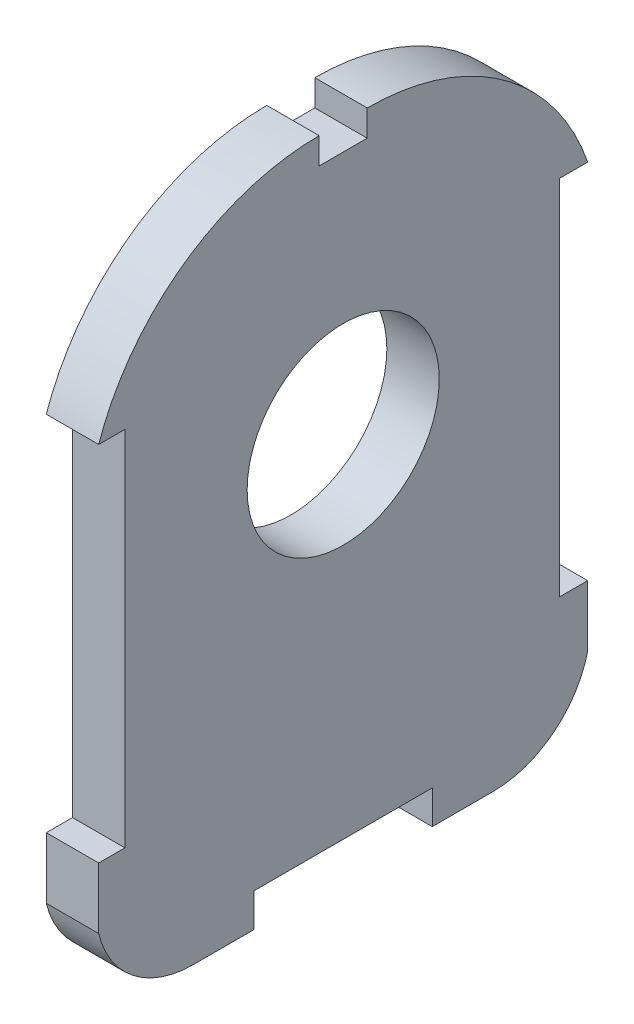
ISO-10303-21;
HEADER;
FILE_DESCRIPTION(('STEP AP214'),'2;1');
FILE_NAME('part.step','',(''),(''),'','','');
FILE_SCHEMA(('AUTOMOTIVE_DESIGN { 1 0 10303 214 1 1 1 1 }'));
ENDSEC;
DATA;
#1=APPLICATION_CONTEXT('core data for automotive mechanical design processes');
#2=APPLICATION_PROTOCOL_DEFINITION('international standard','automotive_design',2000,#1);
#3=PRODUCT_CONTEXT('',#1,'mechanical');
#4=PRODUCT('Part','Part','',(#3));
#5=PRODUCT_RELATED_PRODUCT_CATEGORY('part','',(#4));
#6=PRODUCT_DEFINITION_FORMATION('','',#4);
#7=PRODUCT_DEFINITION_CONTEXT('part definition',#1,'design');
#8=PRODUCT_DEFINITION('design','',#6,#7);
#9=PRODUCT_DEFINITION_SHAPE('','',#8);
#10=(LENGTH_UNIT() NAMED_UNIT(*) SI_UNIT(.MILLI.,.METRE.));
#11=(NAMED_UNIT(*) PLANE_ANGLE_UNIT() SI_UNIT($,.RADIAN.));
#12=(NAMED_UNIT(*) SI_UNIT($,.STERADIAN.) SOLID_ANGLE_UNIT());
#13=UNCERTAINTY_MEASURE_WITH_UNIT(LENGTH_MEASURE(1.E-05),#10,'distance_accuracy_value','');
#14=(GEOMETRIC_REPRESENTATION_CONTEXT(3) GLOBAL_UNCERTAINTY_ASSIGNED_CONTEXT((#13)) GLOBAL_UNIT_ASSIGNED_CONTEXT((#10,
#11,#12)) REPRESENTATION_CONTEXT('',''));
#15=CARTESIAN_POINT('',(0.,0.,0.));
#16=DIRECTION('',(0.,0.,1.));
#17=DIRECTION('',(1.,0.,0.));
#18=AXIS2_PLACEMENT_3D('',#15,#16,#17);
#19=CARTESIAN_POINT('',(6.,0.,2.75));
#20=DIRECTION('',(0.,0.,1.));
#21=DIRECTION('',(1.,0.,0.));
#22=AXIS2_PLACEMENT_3D('',#19,#20,#21);
#23=PLANE('',#22);
#24=DIRECTION('',(0.,1.,0.));
#25=VECTOR('',#24,1.);
#26=CARTESIAN_POINT('',(0.,0.,2.75));
#27=LINE('',#26,#25);
#28=CARTESIAN_POINT('',(0.,69.,2.75));
#29=VERTEX_POINT('',#28);
#30=CARTESIAN_POINT('',(0.,72.,2.75));
#31=VERTEX_POINT('',#30);
#32=EDGE_CURVE('E203',#29,#31,#27,.T.);
#33=ORIENTED_EDGE('',*,*,#32,.T.);
#34=DIRECTION('',(-1.,0.,0.));
#35=VECTOR('',#34,1.);
#36=CARTESIAN_POINT('',(6.,72.,2.75));
#37=LINE('',#36,#35);
#38=CARTESIAN_POINT('',(6.,72.,2.75));
#39=VERTEX_POINT('',#38);
#40=EDGE_CURVE('E11',#39,#31,#37,.T.);
#41=ORIENTED_EDGE('',*,*,#40,.F.);
#42=DIRECTION('',(0.,1.,0.));
#43=VECTOR('',#42,1.);
#44=CARTESIAN_POINT('',(6.,0.,2.75));
#45=LINE('',#44,#43);
#46=CARTESIAN_POINT('',(6.,69.,2.75));
#47=VERTEX_POINT('',#46);
#48=EDGE_CURVE('E393',#47,#39,#45,.T.);
#49=ORIENTED_EDGE('',*,*,#48,.F.);
#50=DIRECTION('',(-1.,0.,0.));
#51=VECTOR('',#50,1.);
#52=CARTESIAN_POINT('',(6.,69.,2.75));
#53=LINE('',#52,#51);
#54=EDGE_CURVE('E60',#47,#29,#53,.T.);
#55=ORIENTED_EDGE('',*,*,#54,.T.);
#56=EDGE_LOOP('',(#33,#41,#49,#55));
#57=FACE_BOUND('',#56,.T.);
#58=ADVANCED_FACE('F43',(#57),#23,.F.);
#59=CARTESIAN_POINT('',(6.,45.2899305555556,2.75));
#60=DIRECTION('',(-1.,0.,0.));
#61=DIRECTION('',(0.,0.,1.));
#62=AXIS2_PLACEMENT_3D('',#59,#60,#61);
#63=CYLINDRICAL_SURFACE('',#62,26.7100694444444);
#64=CARTESIAN_POINT('',(0.,45.2899305555556,2.75));
#65=DIRECTION('',(1.,0.,0.));
#66=DIRECTION('',(0.,0.,-1.));
#67=AXIS2_PLACEMENT_3D('',#64,#65,#66);
#68=CIRCLE('',#67,26.7100694444444);
#69=CARTESIAN_POINT('',(0.,54.,28.));
#70=VERTEX_POINT('',#69);
#71=EDGE_CURVE('E206',#31,#70,#68,.T.);
#72=ORIENTED_EDGE('',*,*,#71,.T.);
#73=DIRECTION('',(-1.,0.,0.));
#74=VECTOR('',#73,1.);
#75=CARTESIAN_POINT('',(6.,54.,28.));
#76=LINE('',#75,#74);
#77=CARTESIAN_POINT('',(6.,54.,28.));
#78=VERTEX_POINT('',#77);
#79=EDGE_CURVE('E52',#78,#70,#76,.T.);
#80=ORIENTED_EDGE('',*,*,#79,.F.);
#81=CARTESIAN_POINT('',(6.,45.2899305555556,2.75));
#82=DIRECTION('',(1.,0.,0.));
#83=DIRECTION('',(0.,0.,-1.));
#84=AXIS2_PLACEMENT_3D('',#81,#82,#83);
#85=CIRCLE('',#84,26.7100694444444);
#86=EDGE_CURVE('E129',#39,#78,#85,.T.);
#87=ORIENTED_EDGE('',*,*,#86,.F.);
#88=ORIENTED_EDGE('',*,*,#40,.T.);
#89=EDGE_LOOP('',(#72,#80,#87,#88));
#90=FACE_BOUND('',#89,.T.);
#91=ADVANCED_FACE('F289',(#90),#63,.T.);
#92=CARTESIAN_POINT('',(6.,54.,0.));
#93=DIRECTION('',(0.,-1.,0.));
#94=DIRECTION('',(0.,0.,-1.));
#95=AXIS2_PLACEMENT_3D('',#92,#93,#94);
#96=PLANE('',#95);
#97=DIRECTION('',(0.,0.,1.));
#98=VECTOR('',#97,1.);
#99=CARTESIAN_POINT('',(0.,54.,0.));
#100=LINE('',#99,#98);
#101=CARTESIAN_POINT('',(0.,54.,25.));
#102=VERTEX_POINT('',#101);
#103=EDGE_CURVE('E209',#102,#70,#100,.T.);
#104=ORIENTED_EDGE('',*,*,#103,.F.);
#105=DIRECTION('',(-1.,0.,0.));
#106=VECTOR('',#105,1.);
#107=CARTESIAN_POINT('',(6.,54.,25.));
#108=LINE('',#107,#106);
#109=CARTESIAN_POINT('',(6.,54.,25.));
#110=VERTEX_POINT('',#109);
#111=EDGE_CURVE('E282',#110,#102,#108,.T.);
#112=ORIENTED_EDGE('',*,*,#111,.F.);
#113=DIRECTION('',(0.,0.,1.));
#114=VECTOR('',#113,1.);
#115=CARTESIAN_POINT('',(6.,54.,0.));
#116=LINE('',#115,#114);
#117=EDGE_CURVE('E288',#110,#78,#116,.T.);
#118=ORIENTED_EDGE('',*,*,#117,.T.);
#119=ORIENTED_EDGE('',*,*,#79,.T.);
#120=EDGE_LOOP('',(#104,#112,#118,#119));
#121=FACE_BOUND('',#120,.T.);
#122=ADVANCED_FACE('F286',(#121),#96,.T.);
#123=CARTESIAN_POINT('',(6.,0.,25.));
#124=DIRECTION('',(0.,0.,-1.));
#125=DIRECTION('',(0.,1.,0.));
#126=AXIS2_PLACEMENT_3D('',#123,#124,#125);
#127=PLANE('',#126);
#128=DIRECTION('',(0.,-1.,0.));
#129=VECTOR('',#128,1.);
#130=CARTESIAN_POINT('',(0.,0.,25.));
#131=LINE('',#130,#129);
#132=CARTESIAN_POINT('',(0.,12.5,25.));
#133=VERTEX_POINT('',#132);
#134=EDGE_CURVE('E212',#102,#133,#131,.T.);
#135=ORIENTED_EDGE('',*,*,#134,.T.);
#136=DIRECTION('',(-1.,0.,0.));
#137=VECTOR('',#136,1.);
#138=CARTESIAN_POINT('',(6.,12.5,25.));
#139=LINE('',#138,#137);
#140=CARTESIAN_POINT('',(6.,12.5,25.));
#141=VERTEX_POINT('',#140);
#142=EDGE_CURVE('E279',#141,#133,#139,.T.);
#143=ORIENTED_EDGE('',*,*,#142,.F.);
#144=DIRECTION('',(0.,-1.,0.));
#145=VECTOR('',#144,1.);
#146=CARTESIAN_POINT('',(6.,0.,25.));
#147=LINE('',#146,#145);
#148=EDGE_CURVE('E307',#110,#141,#147,.T.);
#149=ORIENTED_EDGE('',*,*,#148,.F.);
#150=ORIENTED_EDGE('',*,*,#111,.T.);
#151=EDGE_LOOP('',(#135,#143,#149,#150));
#152=FACE_BOUND('',#151,.T.);
#153=ADVANCED_FACE('F298',(#152),#127,.F.);
#154=CARTESIAN_POINT('',(6.,12.5,0.));
#155=DIRECTION('',(0.,-1.,0.));
#156=DIRECTION('',(0.,0.,-1.));
#157=AXIS2_PLACEMENT_3D('',#154,#155,#156);
#158=PLANE('',#157);
#159=DIRECTION('',(0.,0.,1.));
#160=VECTOR('',#159,1.);
#161=CARTESIAN_POINT('',(0.,12.5,0.));
#162=LINE('',#161,#160);
#163=CARTESIAN_POINT('',(0.,12.5,28.));
#164=VERTEX_POINT('',#163);
#165=EDGE_CURVE('E214',#133,#164,#162,.T.);
#166=ORIENTED_EDGE('',*,*,#165,.T.);
#167=DIRECTION('',(-1.,0.,0.));
#168=VECTOR('',#167,1.);
#169=CARTESIAN_POINT('',(6.,12.5,28.));
#170=LINE('',#169,#168);
#171=CARTESIAN_POINT('',(6.,12.5,28.));
#172=VERTEX_POINT('',#171);
#173=EDGE_CURVE('E276',#172,#164,#170,.T.);
#174=ORIENTED_EDGE('',*,*,#173,.F.);
#175=DIRECTION('',(0.,0.,1.));
#176=VECTOR('',#175,1.);
#177=CARTESIAN_POINT('',(6.,12.5,0.));
#178=LINE('',#177,#176);
#179=EDGE_CURVE('E304',#141,#172,#178,.T.);
#180=ORIENTED_EDGE('',*,*,#179,.F.);
#181=ORIENTED_EDGE('',*,*,#142,.T.);
#182=EDGE_LOOP('',(#166,#174,#180,#181));
#183=FACE_BOUND('',#182,.T.);
#184=ADVANCED_FACE('F302',(#183),#158,.F.);
#185=CARTESIAN_POINT('',(6.,0.,28.));
#186=DIRECTION('',(0.,0.,-1.));
#187=DIRECTION('',(-1.,0.,0.));
#188=AXIS2_PLACEMENT_3D('',#185,#186,#187);
#189=PLANE('',#188);
#190=DIRECTION('',(0.,-1.,0.));
#191=VECTOR('',#190,1.);
#192=CARTESIAN_POINT('',(0.,0.,28.));
#193=LINE('',#192,#191);
#194=CARTESIAN_POINT('',(0.,5.49999999999999,28.));
#195=VERTEX_POINT('',#194);
#196=EDGE_CURVE('E216',#164,#195,#193,.T.);
#197=ORIENTED_EDGE('',*,*,#196,.T.);
#198=DIRECTION('',(-1.,0.,0.));
#199=VECTOR('',#198,1.);
#200=CARTESIAN_POINT('',(6.,5.49999999999999,28.));
#201=LINE('',#200,#199);
#202=CARTESIAN_POINT('',(6.,5.49999999999999,28.));
#203=VERTEX_POINT('',#202);
#204=EDGE_CURVE('E274',#203,#195,#201,.T.);
#205=ORIENTED_EDGE('',*,*,#204,.F.);
#206=DIRECTION('',(0.,-1.,0.));
#207=VECTOR('',#206,1.);
#208=CARTESIAN_POINT('',(6.,0.,28.));
#209=LINE('',#208,#207);
#210=EDGE_CURVE('E306',#172,#203,#209,.T.);
#211=ORIENTED_EDGE('',*,*,#210,.F.);
#212=ORIENTED_EDGE('',*,*,#173,.T.);
#213=EDGE_LOOP('',(#197,#205,#211,#212));
#214=FACE_BOUND('',#213,.T.);
#215=ADVANCED_FACE('F419',(#214),#189,.F.);
#216=CARTESIAN_POINT('',(6.,8.11117647058825,17.2));
#217=DIRECTION('',(-1.,0.,0.));
#218=DIRECTION('',(0.,0.,1.));
#219=AXIS2_PLACEMENT_3D('',#216,#217,#218);
#220=CYLINDRICAL_SURFACE('',#219,11.1111764705882);
#221=CARTESIAN_POINT('',(0.,8.11117647058825,17.2));
#222=DIRECTION('',(1.,0.,0.));
#223=DIRECTION('',(0.,0.,-1.));
#224=AXIS2_PLACEMENT_3D('',#221,#222,#223);
#225=CIRCLE('',#224,11.1111764705882);
#226=CARTESIAN_POINT('',(0.,-3.,17.2));
#227=VERTEX_POINT('',#226);
#228=EDGE_CURVE('E219',#227,#195,#225,.F.);
#229=ORIENTED_EDGE('',*,*,#228,.F.);
#230=DIRECTION('',(-1.,0.,0.));
#231=VECTOR('',#230,1.);
#232=CARTESIAN_POINT('',(6.,-3.,17.2));
#233=LINE('',#232,#231);
#234=CARTESIAN_POINT('',(6.,-3.,17.2));
#235=VERTEX_POINT('',#234);
#236=EDGE_CURVE('E272',#235,#227,#233,.T.);
#237=ORIENTED_EDGE('',*,*,#236,.F.);
#238=CARTESIAN_POINT('',(6.,8.11117647058825,17.2));
#239=DIRECTION('',(1.,0.,0.));
#240=DIRECTION('',(0.,0.,-1.));
#241=AXIS2_PLACEMENT_3D('',#238,#239,#240);
#242=CIRCLE('',#241,11.1111764705882);
#243=EDGE_CURVE('E309',#235,#203,#242,.F.);
#244=ORIENTED_EDGE('',*,*,#243,.T.);
#245=ORIENTED_EDGE('',*,*,#204,.T.);
#246=EDGE_LOOP('',(#229,#237,#244,#245));
#247=FACE_BOUND('',#246,.T.);
#248=ADVANCED_FACE('F422',(#247),#220,.T.);
#249=CARTESIAN_POINT('',(6.,-3.,0.));
#250=DIRECTION('',(0.,-1.,0.));
#251=DIRECTION('',(0.,0.,-1.));
#252=AXIS2_PLACEMENT_3D('',#249,#250,#251);
#253=PLANE('',#252);
#254=DIRECTION('',(0.,0.,1.));
#255=VECTOR('',#254,1.);
#256=CARTESIAN_POINT('',(0.,-3.,0.));
#257=LINE('',#256,#255);
#258=CARTESIAN_POINT('',(0.,-3.,10.2));
#259=VERTEX_POINT('',#258);
#260=EDGE_CURVE('E222',#259,#227,#257,.T.);
#261=ORIENTED_EDGE('',*,*,#260,.F.);
#262=DIRECTION('',(-1.,0.,0.));
#263=VECTOR('',#262,1.);
#264=CARTESIAN_POINT('',(6.,-3.,10.2));
#265=LINE('',#264,#263);
#266=CARTESIAN_POINT('',(6.,-3.,10.2));
#267=VERTEX_POINT('',#266);
#268=EDGE_CURVE('E270',#267,#259,#265,.T.);
#269=ORIENTED_EDGE('',*,*,#268,.F.);
#270=DIRECTION('',(0.,0.,1.));
#271=VECTOR('',#270,1.);
#272=CARTESIAN_POINT('',(6.,-3.,0.));
#273=LINE('',#272,#271);
#274=EDGE_CURVE('E316',#267,#235,#273,.T.);
#275=ORIENTED_EDGE('',*,*,#274,.T.);
#276=ORIENTED_EDGE('',*,*,#236,.T.);
#277=EDGE_LOOP('',(#261,#269,#275,#276));
#278=FACE_BOUND('',#277,.T.);
#279=ADVANCED_FACE('F426',(#278),#253,.T.);
#280=CARTESIAN_POINT('',(6.,0.,10.2));
#281=DIRECTION('',(0.,0.,-1.));
#282=DIRECTION('',(-1.,0.,0.));
#283=AXIS2_PLACEMENT_3D('',#280,#281,#282);
#284=PLANE('',#283);
#285=DIRECTION('',(0.,-1.,0.));
#286=VECTOR('',#285,1.);
#287=CARTESIAN_POINT('',(0.,0.,10.2));
#288=LINE('',#287,#286);
#289=CARTESIAN_POINT('',(0.,0.,10.2));
#290=VERTEX_POINT('',#289);
#291=EDGE_CURVE('E225',#290,#259,#288,.T.);
#292=ORIENTED_EDGE('',*,*,#291,.F.);
#293=DIRECTION('',(0.99026806874157,0.139173100960066,0.));
#294=VECTOR('',#293,1.);
#295=CARTESIAN_POINT('',(0.,0.,10.2));
#296=LINE('',#295,#294);
#297=CARTESIAN_POINT('',(6.,0.843245008214351,10.2));
#298=VERTEX_POINT('',#297);
#299=EDGE_CURVE('E365',#290,#298,#296,.T.);
#300=ORIENTED_EDGE('',*,*,#299,.T.);
#301=DIRECTION('',(0.,-1.,0.));
#302=VECTOR('',#301,1.);
#303=CARTESIAN_POINT('',(6.,0.,10.2));
#304=LINE('',#303,#302);
#305=EDGE_CURVE('E319',#298,#267,#304,.T.);
#306=ORIENTED_EDGE('',*,*,#305,.T.);
#307=ORIENTED_EDGE('',*,*,#268,.T.);
#308=EDGE_LOOP('',(#292,#300,#306,#307));
#309=FACE_BOUND('',#308,.T.);
#310=ADVANCED_FACE('F430',(#309),#284,.T.);
#311=CARTESIAN_POINT('',(6.,0.,-10.2));
#312=DIRECTION('',(0.,0.,-1.));
#313=DIRECTION('',(-1.,0.,0.));
#314=AXIS2_PLACEMENT_3D('',#311,#312,#313);
#315=PLANE('',#314);
#316=DIRECTION('',(0.,-1.,0.));
#317=VECTOR('',#316,1.);
#318=CARTESIAN_POINT('',(0.,0.,-10.2));
#319=LINE('',#318,#317);
#320=CARTESIAN_POINT('',(0.,0.,-10.2));
#321=VERTEX_POINT('',#320);
#322=CARTESIAN_POINT('',(0.,-3.,-10.2));
#323=VERTEX_POINT('',#322);
#324=EDGE_CURVE('E231',#321,#323,#319,.T.);
#325=ORIENTED_EDGE('',*,*,#324,.T.);
#326=DIRECTION('',(-1.,0.,0.));
#327=VECTOR('',#326,1.);
#328=CARTESIAN_POINT('',(6.,-3.,-10.2));
#329=LINE('',#328,#327);
#330=CARTESIAN_POINT('',(6.,-3.,-10.2));
#331=VERTEX_POINT('',#330);
#332=EDGE_CURVE('E267',#331,#323,#329,.T.);
#333=ORIENTED_EDGE('',*,*,#332,.F.);
#334=DIRECTION('',(0.,-1.,0.));
#335=VECTOR('',#334,1.);
#336=CARTESIAN_POINT('',(6.,0.,-10.2));
#337=LINE('',#336,#335);
#338=CARTESIAN_POINT('',(6.,0.843245008214351,-10.2));
#339=VERTEX_POINT('',#338);
#340=EDGE_CURVE('E322',#339,#331,#337,.T.);
#341=ORIENTED_EDGE('',*,*,#340,.F.);
#342=DIRECTION('',(-0.99026806874157,-0.139173100960066,0.));
#343=VECTOR('',#342,1.);
#344=CARTESIAN_POINT('',(0.,0.,-10.2));
#345=LINE('',#344,#343);
#346=EDGE_CURVE('E363',#339,#321,#345,.T.);
#347=ORIENTED_EDGE('',*,*,#346,.T.);
#348=EDGE_LOOP('',(#325,#333,#341,#347));
#349=FACE_BOUND('',#348,.T.);
#350=ADVANCED_FACE('F369',(#349),#315,.F.);
#351=CARTESIAN_POINT('',(6.,-3.,0.));
#352=DIRECTION('',(0.,1.,0.));
#353=DIRECTION('',(0.,0.,1.));
#354=AXIS2_PLACEMENT_3D('',#351,#352,#353);
#355=PLANE('',#354);
#356=DIRECTION('',(0.,0.,-1.));
#357=VECTOR('',#356,1.);
#358=CARTESIAN_POINT('',(0.,-3.,0.));
#359=LINE('',#358,#357);
#360=CARTESIAN_POINT('',(0.,-3.,-17.2));
#361=VERTEX_POINT('',#360);
#362=EDGE_CURVE('E233',#323,#361,#359,.T.);
#363=ORIENTED_EDGE('',*,*,#362,.T.);
#364=DIRECTION('',(-1.,0.,0.));
#365=VECTOR('',#364,1.);
#366=CARTESIAN_POINT('',(6.,-3.,-17.2));
#367=LINE('',#366,#365);
#368=CARTESIAN_POINT('',(6.,-3.,-17.2));
#369=VERTEX_POINT('',#368);
#370=EDGE_CURVE('E264',#369,#361,#367,.T.);
#371=ORIENTED_EDGE('',*,*,#370,.F.);
#372=DIRECTION('',(0.,0.,-1.));
#373=VECTOR('',#372,1.);
#374=CARTESIAN_POINT('',(6.,-3.,0.));
#375=LINE('',#374,#373);
#376=EDGE_CURVE('E324',#331,#369,#375,.T.);
#377=ORIENTED_EDGE('',*,*,#376,.F.);
#378=ORIENTED_EDGE('',*,*,#332,.T.);
#379=EDGE_LOOP('',(#363,#371,#377,#378));
#380=FACE_BOUND('',#379,.T.);
#381=ADVANCED_FACE('F377',(#380),#355,.F.);
#382=CARTESIAN_POINT('',(6.,8.11117647058825,-17.2));
#383=DIRECTION('',(-1.,0.,0.));
#384=DIRECTION('',(0.,0.,1.));
#385=AXIS2_PLACEMENT_3D('',#382,#383,#384);
#386=CYLINDRICAL_SURFACE('',#385,11.1111764705882);
#387=CARTESIAN_POINT('',(0.,8.11117647058825,-17.2));
#388=DIRECTION('',(1.,0.,0.));
#389=DIRECTION('',(0.,0.,-1.));
#390=AXIS2_PLACEMENT_3D('',#387,#388,#389);
#391=CIRCLE('',#390,11.1111764705882);
#392=CARTESIAN_POINT('',(0.,5.49999999999999,-28.));
#393=VERTEX_POINT('',#392);
#394=EDGE_CURVE('E235',#361,#393,#391,.T.);
#395=ORIENTED_EDGE('',*,*,#394,.T.);
#396=DIRECTION('',(-1.,0.,0.));
#397=VECTOR('',#396,1.);
#398=CARTESIAN_POINT('',(6.,5.49999999999999,-28.));
#399=LINE('',#398,#397);
#400=CARTESIAN_POINT('',(6.,5.49999999999999,-28.));
#401=VERTEX_POINT('',#400);
#402=EDGE_CURVE('E262',#401,#393,#399,.T.);
#403=ORIENTED_EDGE('',*,*,#402,.F.);
#404=CARTESIAN_POINT('',(6.,8.11117647058825,-17.2));
#405=DIRECTION('',(1.,0.,0.));
#406=DIRECTION('',(0.,0.,-1.));
#407=AXIS2_PLACEMENT_3D('',#404,#405,#406);
#408=CIRCLE('',#407,11.1111764705882);
#409=EDGE_CURVE('E326',#369,#401,#408,.T.);
#410=ORIENTED_EDGE('',*,*,#409,.F.);
#411=ORIENTED_EDGE('',*,*,#370,.T.);
#412=EDGE_LOOP('',(#395,#403,#410,#411));
#413=FACE_BOUND('',#412,.T.);
#414=ADVANCED_FACE('F381',(#413),#386,.T.);
#415=CARTESIAN_POINT('',(6.,0.,-28.));
#416=DIRECTION('',(0.,0.,-1.));
#417=DIRECTION('',(-1.,0.,0.));
#418=AXIS2_PLACEMENT_3D('',#415,#416,#417);
#419=PLANE('',#418);
#420=DIRECTION('',(0.,-1.,0.));
#421=VECTOR('',#420,1.);
#422=CARTESIAN_POINT('',(0.,0.,-28.));
#423=LINE('',#422,#421);
#424=CARTESIAN_POINT('',(0.,12.5,-28.));
#425=VERTEX_POINT('',#424);
#426=EDGE_CURVE('E238',#425,#393,#423,.T.);
#427=ORIENTED_EDGE('',*,*,#426,.F.);
#428=DIRECTION('',(-1.,0.,0.));
#429=VECTOR('',#428,1.);
#430=CARTESIAN_POINT('',(6.,12.5,-28.));
#431=LINE('',#430,#429);
#432=CARTESIAN_POINT('',(6.,12.5,-28.));
#433=VERTEX_POINT('',#432);
#434=EDGE_CURVE('E260',#433,#425,#431,.T.);
#435=ORIENTED_EDGE('',*,*,#434,.F.);
#436=DIRECTION('',(0.,-1.,0.));
#437=VECTOR('',#436,1.);
#438=CARTESIAN_POINT('',(6.,0.,-28.));
#439=LINE('',#438,#437);
#440=EDGE_CURVE('E328',#433,#401,#439,.T.);
#441=ORIENTED_EDGE('',*,*,#440,.T.);
#442=ORIENTED_EDGE('',*,*,#402,.T.);
#443=EDGE_LOOP('',(#427,#435,#441,#442));
#444=FACE_BOUND('',#443,.T.);
#445=ADVANCED_FACE('F441',(#444),#419,.T.);
#446=CARTESIAN_POINT('',(6.,12.5,0.));
#447=DIRECTION('',(0.,1.,0.));
#448=DIRECTION('',(0.,0.,1.));
#449=AXIS2_PLACEMENT_3D('',#446,#447,#448);
#450=PLANE('',#449);
#451=DIRECTION('',(0.,0.,-1.));
#452=VECTOR('',#451,1.);
#453=CARTESIAN_POINT('',(0.,12.5,0.));
#454=LINE('',#453,#452);
#455=CARTESIAN_POINT('',(0.,12.5,-25.));
#456=VERTEX_POINT('',#455);
#457=EDGE_CURVE('E241',#456,#425,#454,.T.);
#458=ORIENTED_EDGE('',*,*,#457,.F.);
#459=DIRECTION('',(0.999144619181282,0.,0.0413525085223603));
#460=VECTOR('',#459,1.);
#461=CARTESIAN_POINT('',(6.,12.5,-24.7516725343149));
#462=LINE('',#461,#460);
#463=CARTESIAN_POINT('',(6.,12.5,-24.7516725343149));
#464=VERTEX_POINT('',#463);
#465=EDGE_CURVE('E204',#456,#464,#462,.T.);
#466=ORIENTED_EDGE('',*,*,#465,.T.);
#467=DIRECTION('',(0.,0.,-1.));
#468=VECTOR('',#467,1.);
#469=CARTESIAN_POINT('',(6.,12.5,0.));
#470=LINE('',#469,#468);
#471=EDGE_CURVE('E331',#464,#433,#470,.T.);
#472=ORIENTED_EDGE('',*,*,#471,.T.);
#473=ORIENTED_EDGE('',*,*,#434,.T.);
#474=EDGE_LOOP('',(#458,#466,#472,#473));
#475=FACE_BOUND('',#474,.T.);
#476=ADVANCED_FACE('F337',(#475),#450,.T.);
#477=CARTESIAN_POINT('',(6.,54.,0.));
#478=DIRECTION('',(0.,1.,0.));
#479=DIRECTION('',(0.,0.,1.));
#480=AXIS2_PLACEMENT_3D('',#477,#478,#479);
#481=PLANE('',#480);
#482=DIRECTION('',(0.,0.,-1.));
#483=VECTOR('',#482,1.);
#484=CARTESIAN_POINT('',(0.,54.,0.));
#485=LINE('',#484,#483);
#486=CARTESIAN_POINT('',(0.,54.,-25.));
#487=VERTEX_POINT('',#486);
#488=CARTESIAN_POINT('',(0.,54.,-28.));
#489=VERTEX_POINT('',#488);
#490=EDGE_CURVE('E247',#487,#489,#485,.T.);
#491=ORIENTED_EDGE('',*,*,#490,.T.);
#492=DIRECTION('',(-1.,0.,0.));
#493=VECTOR('',#492,1.);
#494=CARTESIAN_POINT('',(6.,54.,-28.));
#495=LINE('',#494,#493);
#496=CARTESIAN_POINT('',(6.,54.,-28.));
#497=VERTEX_POINT('',#496);
#498=EDGE_CURVE('E180',#497,#489,#495,.T.);
#499=ORIENTED_EDGE('',*,*,#498,.F.);
#500=DIRECTION('',(0.,0.,-1.));
#501=VECTOR('',#500,1.);
#502=CARTESIAN_POINT('',(6.,54.,0.));
#503=LINE('',#502,#501);
#504=CARTESIAN_POINT('',(6.,54.,-24.7516725343149));
#505=VERTEX_POINT('',#504);
#506=EDGE_CURVE('E191',#505,#497,#503,.T.);
#507=ORIENTED_EDGE('',*,*,#506,.F.);
#508=DIRECTION('',(-0.999144619181282,0.,-0.0413525085223603));
#509=VECTOR('',#508,1.);
#510=CARTESIAN_POINT('',(6.,54.,-24.7516725343149));
#511=LINE('',#510,#509);
#512=EDGE_CURVE('E385',#505,#487,#511,.T.);
#513=ORIENTED_EDGE('',*,*,#512,.T.);
#514=EDGE_LOOP('',(#491,#499,#507,#513));
#515=FACE_BOUND('',#514,.T.);
#516=ADVANCED_FACE('F446',(#515),#481,.F.);
#517=CARTESIAN_POINT('',(6.,45.2899305555556,-2.75));
#518=DIRECTION('',(-1.,0.,0.));
#519=DIRECTION('',(0.,0.,1.));
#520=AXIS2_PLACEMENT_3D('',#517,#518,#519);
#521=CYLINDRICAL_SURFACE('',#520,26.7100694444444);
#522=CARTESIAN_POINT('',(0.,45.2899305555556,-2.75));
#523=DIRECTION('',(1.,0.,0.));
#524=DIRECTION('',(0.,0.,-1.));
#525=AXIS2_PLACEMENT_3D('',#522,#523,#524);
#526=CIRCLE('',#525,26.7100694444444);
#527=CARTESIAN_POINT('',(0.,72.,-2.75));
#528=VERTEX_POINT('',#527);
#529=EDGE_CURVE('E176',#528,#489,#526,.F.);
#530=ORIENTED_EDGE('',*,*,#529,.F.);
#531=DIRECTION('',(-1.,0.,0.));
#532=VECTOR('',#531,1.);
#533=CARTESIAN_POINT('',(6.,72.,-2.75));
#534=LINE('',#533,#532);
#535=CARTESIAN_POINT('',(6.,72.,-2.75));
#536=VERTEX_POINT('',#535);
#537=EDGE_CURVE('E171',#536,#528,#534,.T.);
#538=ORIENTED_EDGE('',*,*,#537,.F.);
#539=CARTESIAN_POINT('',(6.,45.2899305555556,-2.75));
#540=DIRECTION('',(1.,0.,0.));
#541=DIRECTION('',(0.,0.,-1.));
#542=AXIS2_PLACEMENT_3D('',#539,#540,#541);
#543=CIRCLE('',#542,26.7100694444444);
#544=EDGE_CURVE('E174',#536,#497,#543,.F.);
#545=ORIENTED_EDGE('',*,*,#544,.T.);
#546=ORIENTED_EDGE('',*,*,#498,.T.);
#547=EDGE_LOOP('',(#530,#538,#545,#546));
#548=FACE_BOUND('',#547,.T.);
#549=ADVANCED_FACE('F173',(#548),#521,.T.);
#550=CARTESIAN_POINT('',(6.,0.,-2.75));
#551=DIRECTION('',(0.,0.,1.));
#552=DIRECTION('',(1.,0.,0.));
#553=AXIS2_PLACEMENT_3D('',#550,#551,#552);
#554=PLANE('',#553);
#555=DIRECTION('',(0.,1.,0.));
#556=VECTOR('',#555,1.);
#557=CARTESIAN_POINT('',(0.,0.,-2.75));
#558=LINE('',#557,#556);
#559=CARTESIAN_POINT('',(0.,69.,-2.75));
#560=VERTEX_POINT('',#559);
#561=EDGE_CURVE('E251',#560,#528,#558,.T.);
#562=ORIENTED_EDGE('',*,*,#561,.F.);
#563=DIRECTION('',(-1.,0.,0.));
#564=VECTOR('',#563,1.);
#565=CARTESIAN_POINT('',(6.,69.,-2.75));
#566=LINE('',#565,#564);
#567=CARTESIAN_POINT('',(6.,69.,-2.75));
#568=VERTEX_POINT('',#567);
#569=EDGE_CURVE('E117',#568,#560,#566,.T.);
#570=ORIENTED_EDGE('',*,*,#569,.F.);
#571=DIRECTION('',(0.,1.,0.));
#572=VECTOR('',#571,1.);
#573=CARTESIAN_POINT('',(6.,0.,-2.75));
#574=LINE('',#573,#572);
#575=EDGE_CURVE('E188',#568,#536,#574,.T.);
#576=ORIENTED_EDGE('',*,*,#575,.T.);
#577=ORIENTED_EDGE('',*,*,#537,.T.);
#578=EDGE_LOOP('',(#562,#570,#576,#577));
#579=FACE_BOUND('',#578,.T.);
#580=ADVANCED_FACE('F194',(#579),#554,.T.);
#581=CARTESIAN_POINT('',(6.,41.,0.));
#582=DIRECTION('',(-1.,0.,0.));
#583=DIRECTION('',(0.,0.,1.));
#584=AXIS2_PLACEMENT_3D('',#581,#582,#583);
#585=CYLINDRICAL_SURFACE('',#584,11.);
#586=CARTESIAN_POINT('',(6.,41.,0.));
#587=DIRECTION('',(1.,0.,0.));
#588=DIRECTION('',(0.,0.,-1.));
#589=AXIS2_PLACEMENT_3D('',#586,#587,#588);
#590=CIRCLE('',#589,11.);
#591=CARTESIAN_POINT('',(6.,41.,-11.));
#592=VERTEX_POINT('',#591);
#593=EDGE_CURVE('E256',#592,#592,#590,.T.);
#594=ORIENTED_EDGE('',*,*,#593,.T.);
#595=EDGE_LOOP('',(#594));
#596=FACE_BOUND('',#595,.T.);
#597=CARTESIAN_POINT('',(0.,41.,0.));
#598=DIRECTION('',(1.,0.,0.));
#599=DIRECTION('',(0.,0.,-1.));
#600=AXIS2_PLACEMENT_3D('',#597,#598,#599);
#601=CIRCLE('',#600,11.);
#602=CARTESIAN_POINT('',(0.,41.,-11.));
#603=VERTEX_POINT('',#602);
#604=EDGE_CURVE('E200',#603,#603,#601,.T.);
#605=ORIENTED_EDGE('',*,*,#604,.F.);
#606=EDGE_LOOP('',(#605));
#607=FACE_BOUND('',#606,.T.);
#608=ADVANCED_FACE('F45',(#596,#607),#585,.F.);
#609=CARTESIAN_POINT('',(6.,69.,0.));
#610=DIRECTION('',(0.,1.,0.));
#611=DIRECTION('',(0.,0.,1.));
#612=AXIS2_PLACEMENT_3D('',#609,#610,#611);
#613=PLANE('',#612);
#614=DIRECTION('',(0.,0.,-1.));
#615=VECTOR('',#614,1.);
#616=CARTESIAN_POINT('',(0.,69.,0.));
#617=LINE('',#616,#615);
#618=EDGE_CURVE('E253',#29,#560,#617,.T.);
#619=ORIENTED_EDGE('',*,*,#618,.F.);
#620=ORIENTED_EDGE('',*,*,#54,.F.);
#621=DIRECTION('',(0.,0.,-1.));
#622=VECTOR('',#621,1.);
#623=CARTESIAN_POINT('',(6.,69.,0.));
#624=LINE('',#623,#622);
#625=EDGE_CURVE('E195',#47,#568,#624,.T.);
#626=ORIENTED_EDGE('',*,*,#625,.T.);
#627=ORIENTED_EDGE('',*,*,#569,.T.);
#628=EDGE_LOOP('',(#619,#620,#626,#627));
#629=FACE_BOUND('',#628,.T.);
#630=ADVANCED_FACE('F395',(#629),#613,.T.);
#631=CARTESIAN_POINT('',(6.,0.,0.));
#632=DIRECTION('',(1.,0.,0.));
#633=DIRECTION('',(0.,0.,-1.));
#634=AXIS2_PLACEMENT_3D('',#631,#632,#633);
#635=PLANE('',#634);
#636=DIRECTION('',(0.,0.,-1.));
#637=VECTOR('',#636,1.);
#638=CARTESIAN_POINT('',(6.,0.843245008214351,16.2589654351117));
#639=LINE('',#638,#637);
#640=EDGE_CURVE('E371',#298,#339,#639,.T.);
#641=ORIENTED_EDGE('',*,*,#640,.T.);
#642=ORIENTED_EDGE('',*,*,#340,.T.);
#643=ORIENTED_EDGE('',*,*,#376,.T.);
#644=ORIENTED_EDGE('',*,*,#409,.T.);
#645=ORIENTED_EDGE('',*,*,#440,.F.);
#646=ORIENTED_EDGE('',*,*,#471,.F.);
#647=DIRECTION('',(0.,1.,0.));
#648=VECTOR('',#647,1.);
#649=CARTESIAN_POINT('',(6.,6.49486332127123,-24.7516725343149));
#650=LINE('',#649,#648);
#651=EDGE_CURVE('E342',#464,#505,#650,.T.);
#652=ORIENTED_EDGE('',*,*,#651,.T.);
#653=ORIENTED_EDGE('',*,*,#506,.T.);
#654=ORIENTED_EDGE('',*,*,#544,.F.);
#655=ORIENTED_EDGE('',*,*,#575,.F.);
#656=ORIENTED_EDGE('',*,*,#625,.F.);
#657=ORIENTED_EDGE('',*,*,#48,.T.);
#658=ORIENTED_EDGE('',*,*,#86,.T.);
#659=ORIENTED_EDGE('',*,*,#117,.F.);
#660=ORIENTED_EDGE('',*,*,#148,.T.);
#661=ORIENTED_EDGE('',*,*,#179,.T.);
#662=ORIENTED_EDGE('',*,*,#210,.T.);
#663=ORIENTED_EDGE('',*,*,#243,.F.);
#664=ORIENTED_EDGE('',*,*,#274,.F.);
#665=ORIENTED_EDGE('',*,*,#305,.F.);
#666=EDGE_LOOP('',(#641,#642,#643,#644,#645,#646,#652,#653,#654,#655,#656,#657,#658,#659,#660,
#661,#662,#663,#664,#665));
#667=FACE_BOUND('',#666,.T.);
#668=ORIENTED_EDGE('',*,*,#593,.F.);
#669=EDGE_LOOP('',(#668));
#670=FACE_BOUND('',#669,.T.);
#671=ADVANCED_FACE('F185',(#667,#670),#635,.T.);
#672=CARTESIAN_POINT('',(0.,0.,0.));
#673=DIRECTION('',(1.,0.,0.));
#674=DIRECTION('',(0.,0.,-1.));
#675=AXIS2_PLACEMENT_3D('',#672,#673,#674);
#676=PLANE('',#675);
#677=ORIENTED_EDGE('',*,*,#604,.T.);
#678=EDGE_LOOP('',(#677));
#679=FACE_BOUND('',#678,.T.);
#680=ORIENTED_EDGE('',*,*,#32,.F.);
#681=ORIENTED_EDGE('',*,*,#618,.T.);
#682=ORIENTED_EDGE('',*,*,#561,.T.);
#683=ORIENTED_EDGE('',*,*,#529,.T.);
#684=ORIENTED_EDGE('',*,*,#490,.F.);
#685=DIRECTION('',(0.,-1.,0.));
#686=VECTOR('',#685,1.);
#687=CARTESIAN_POINT('',(0.,0.,-25.));
#688=LINE('',#687,#686);
#689=EDGE_CURVE('E244',#487,#456,#688,.T.);
#690=ORIENTED_EDGE('',*,*,#689,.T.);
#691=ORIENTED_EDGE('',*,*,#457,.T.);
#692=ORIENTED_EDGE('',*,*,#426,.T.);
#693=ORIENTED_EDGE('',*,*,#394,.F.);
#694=ORIENTED_EDGE('',*,*,#362,.F.);
#695=ORIENTED_EDGE('',*,*,#324,.F.);
#696=DIRECTION('',(0.,0.,-1.));
#697=VECTOR('',#696,1.);
#698=CARTESIAN_POINT('',(0.,0.,0.));
#699=LINE('',#698,#697);
#700=EDGE_CURVE('E228',#290,#321,#699,.T.);
#701=ORIENTED_EDGE('',*,*,#700,.F.);
#702=ORIENTED_EDGE('',*,*,#291,.T.);
#703=ORIENTED_EDGE('',*,*,#260,.T.);
#704=ORIENTED_EDGE('',*,*,#228,.T.);
#705=ORIENTED_EDGE('',*,*,#196,.F.);
#706=ORIENTED_EDGE('',*,*,#165,.F.);
#707=ORIENTED_EDGE('',*,*,#134,.F.);
#708=ORIENTED_EDGE('',*,*,#103,.T.);
#709=ORIENTED_EDGE('',*,*,#71,.F.);
#710=EDGE_LOOP('',(#680,#681,#682,#683,#684,#690,#691,#692,#693,#694,#695,#701,#702,#703,#704,
#705,#706,#707,#708,#709));
#711=FACE_BOUND('',#710,.T.);
#712=ADVANCED_FACE('F293',(#679,#711),#676,.F.);
#713=CARTESIAN_POINT('',(6.,6.49486332127123,-24.7516725343149));
#714=DIRECTION('',(0.0413525085223603,0.,-0.999144619181282));
#715=DIRECTION('',(-0.999144619181282,0.,-0.0413525085223603));
#716=AXIS2_PLACEMENT_3D('',#713,#714,#715);
#717=PLANE('',#716);
#718=ORIENTED_EDGE('',*,*,#689,.F.);
#719=ORIENTED_EDGE('',*,*,#512,.F.);
#720=ORIENTED_EDGE('',*,*,#651,.F.);
#721=ORIENTED_EDGE('',*,*,#465,.F.);
#722=EDGE_LOOP('',(#718,#719,#720,#721));
#723=FACE_BOUND('',#722,.T.);
#724=ADVANCED_FACE('F480',(#723),#717,.T.);
#725=CARTESIAN_POINT('',(0.,0.,16.2589654351117));
#726=DIRECTION('',(0.139173100960066,-0.99026806874157,0.));
#727=DIRECTION('',(0.99026806874157,0.139173100960066,0.));
#728=AXIS2_PLACEMENT_3D('',#725,#726,#727);
#729=PLANE('',#728);
#730=ORIENTED_EDGE('',*,*,#700,.T.);
#731=ORIENTED_EDGE('',*,*,#346,.F.);
#732=ORIENTED_EDGE('',*,*,#640,.F.);
#733=ORIENTED_EDGE('',*,*,#299,.F.);
#734=EDGE_LOOP('',(#730,#731,#732,#733));
#735=FACE_BOUND('',#734,.T.);
#736=ADVANCED_FACE('F361',(#735),#729,.T.);
#737=CLOSED_SHELL('',(#58,#91,#122,#153,#184,#215,#248,#279,#310,#350,#381,#414,#445,#476,#516,
#549,#580,#608,#630,#671,#712,#724,#736));
#738=MANIFOLD_SOLID_BREP('B2',#737);
#739=ADVANCED_BREP_SHAPE_REPRESENTATION('',(#18,#738),#14);
#740=SHAPE_DEFINITION_REPRESENTATION(#9,#739);
ENDSEC;
END-ISO-10303-21;
